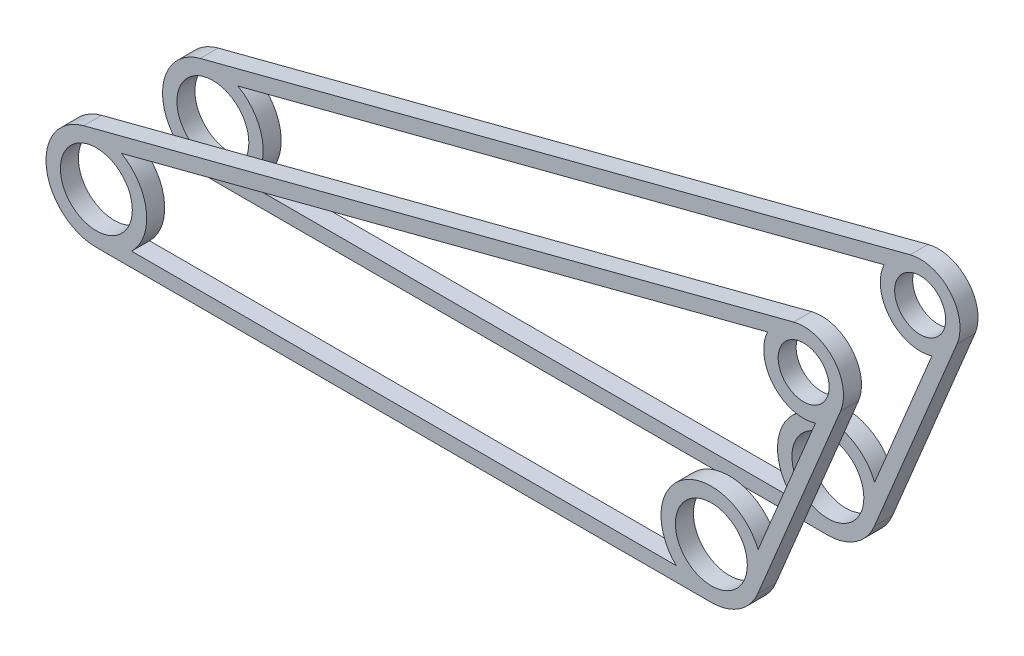
ISO-10303-21;
HEADER;
FILE_DESCRIPTION(('STEP AP214'),'2;1');
FILE_NAME('part.step','',(''),(''),'','','');
FILE_SCHEMA(('AUTOMOTIVE_DESIGN { 1 0 10303 214 1 1 1 1 }'));
ENDSEC;
DATA;
#1=APPLICATION_CONTEXT('core data for automotive mechanical design processes');
#2=APPLICATION_PROTOCOL_DEFINITION('international standard','automotive_design',2000,#1);
#3=PRODUCT_CONTEXT('',#1,'mechanical');
#4=PRODUCT('Part','Part','',(#3));
#5=PRODUCT_RELATED_PRODUCT_CATEGORY('part','',(#4));
#6=PRODUCT_DEFINITION_FORMATION('','',#4);
#7=PRODUCT_DEFINITION_CONTEXT('part definition',#1,'design');
#8=PRODUCT_DEFINITION('design','',#6,#7);
#9=PRODUCT_DEFINITION_SHAPE('','',#8);
#10=(LENGTH_UNIT() NAMED_UNIT(*) SI_UNIT(.MILLI.,.METRE.));
#11=(NAMED_UNIT(*) PLANE_ANGLE_UNIT() SI_UNIT($,.RADIAN.));
#12=(NAMED_UNIT(*) SI_UNIT($,.STERADIAN.) SOLID_ANGLE_UNIT());
#13=UNCERTAINTY_MEASURE_WITH_UNIT(LENGTH_MEASURE(1.E-05),#10,'distance_accuracy_value','');
#14=(GEOMETRIC_REPRESENTATION_CONTEXT(3) GLOBAL_UNCERTAINTY_ASSIGNED_CONTEXT((#13)) GLOBAL_UNIT_ASSIGNED_CONTEXT((#10,
#11,#12)) REPRESENTATION_CONTEXT('',''));
#15=CARTESIAN_POINT('',(0.,0.,0.));
#16=DIRECTION('',(0.,0.,1.));
#17=DIRECTION('',(1.,0.,0.));
#18=AXIS2_PLACEMENT_3D('',#15,#16,#17);
#19=CARTESIAN_POINT('',(108.585,0.,-11.8745));
#20=DIRECTION('',(0.,0.,1.));
#21=DIRECTION('',(1.,0.,0.));
#22=AXIS2_PLACEMENT_3D('',#19,#20,#21);
#23=CYLINDRICAL_SURFACE('',#22,8.88999999999992);
#24=CARTESIAN_POINT('',(108.585,0.,-8.6995));
#25=DIRECTION('',(0.,0.,1.));
#26=DIRECTION('',(1.,0.,0.));
#27=AXIS2_PLACEMENT_3D('',#24,#25,#26);
#28=CIRCLE('',#27,8.88999999999992);
#29=CARTESIAN_POINT('',(108.585,-8.88999999999996,-8.6995));
#30=VERTEX_POINT('',#29);
#31=CARTESIAN_POINT('',(116.796258377343,-3.40695404437924,-8.6995));
#32=VERTEX_POINT('',#31);
#33=EDGE_CURVE('E202',#30,#32,#28,.T.);
#34=ORIENTED_EDGE('',*,*,#33,.F.);
#35=DIRECTION('',(0.,0.,1.));
#36=VECTOR('',#35,1.);
#37=CARTESIAN_POINT('',(108.585,-8.88999999999996,-11.8745));
#38=LINE('',#37,#36);
#39=CARTESIAN_POINT('',(108.585,-8.88999999999996,-11.8745));
#40=VERTEX_POINT('',#39);
#41=EDGE_CURVE('E12',#40,#30,#38,.T.);
#42=ORIENTED_EDGE('',*,*,#41,.F.);
#43=CARTESIAN_POINT('',(108.585,0.,-11.8745));
#44=DIRECTION('',(0.,0.,1.));
#45=DIRECTION('',(1.,0.,0.));
#46=AXIS2_PLACEMENT_3D('',#43,#44,#45);
#47=CIRCLE('',#46,8.88999999999992);
#48=CARTESIAN_POINT('',(116.796258377343,-3.40695404437924,-11.8745));
#49=VERTEX_POINT('',#48);
#50=EDGE_CURVE('E304',#40,#49,#47,.T.);
#51=ORIENTED_EDGE('',*,*,#50,.T.);
#52=DIRECTION('',(0.,0.,1.));
#53=VECTOR('',#52,1.);
#54=CARTESIAN_POINT('',(116.796258377343,-3.40695404437924,-11.8745));
#55=LINE('',#54,#53);
#56=EDGE_CURVE('E224',#49,#32,#55,.T.);
#57=ORIENTED_EDGE('',*,*,#56,.T.);
#58=EDGE_LOOP('',(#34,#42,#51,#57));
#59=FACE_BOUND('',#58,.T.);
#60=ADVANCED_FACE('F53',(#59),#23,.T.);
#61=CARTESIAN_POINT('',(0.,-8.89,-11.8745));
#62=DIRECTION('',(0.,1.,0.));
#63=DIRECTION('',(0.,0.,1.));
#64=AXIS2_PLACEMENT_3D('',#61,#62,#63);
#65=PLANE('',#64);
#66=DIRECTION('',(-1.,0.,0.));
#67=VECTOR('',#66,1.);
#68=CARTESIAN_POINT('',(0.,-8.89,-8.6995));
#69=LINE('',#68,#67);
#70=CARTESIAN_POINT('',(0.,-8.89,-8.6995));
#71=VERTEX_POINT('',#70);
#72=EDGE_CURVE('E214',#30,#71,#69,.T.);
#73=ORIENTED_EDGE('',*,*,#72,.T.);
#74=DIRECTION('',(0.,0.,1.));
#75=VECTOR('',#74,1.);
#76=CARTESIAN_POINT('',(0.,-8.89,-11.8745));
#77=LINE('',#76,#75);
#78=CARTESIAN_POINT('',(0.,-8.89,-11.8745));
#79=VERTEX_POINT('',#78);
#80=EDGE_CURVE('E63',#79,#71,#77,.T.);
#81=ORIENTED_EDGE('',*,*,#80,.F.);
#82=DIRECTION('',(-1.,0.,0.));
#83=VECTOR('',#82,1.);
#84=CARTESIAN_POINT('',(0.,-8.89,-11.8745));
#85=LINE('',#84,#83);
#86=EDGE_CURVE('E170',#40,#79,#85,.T.);
#87=ORIENTED_EDGE('',*,*,#86,.F.);
#88=ORIENTED_EDGE('',*,*,#41,.T.);
#89=EDGE_LOOP('',(#73,#81,#87,#88));
#90=FACE_BOUND('',#89,.T.);
#91=ADVANCED_FACE('F261',(#90),#65,.F.);
#92=CARTESIAN_POINT('',(0.,0.,-11.8745));
#93=DIRECTION('',(0.,0.,1.));
#94=DIRECTION('',(1.,0.,0.));
#95=AXIS2_PLACEMENT_3D('',#92,#93,#94);
#96=CYLINDRICAL_SURFACE('',#95,8.89);
#97=CARTESIAN_POINT('',(0.,0.,-8.6995));
#98=DIRECTION('',(0.,0.,1.));
#99=DIRECTION('',(1.,0.,0.));
#100=AXIS2_PLACEMENT_3D('',#97,#98,#99);
#101=CIRCLE('',#100,8.89);
#102=CARTESIAN_POINT('',(-2.24093910567499,8.60292345221417,-8.6995));
#103=VERTEX_POINT('',#102);
#104=EDGE_CURVE('E153',#103,#71,#101,.T.);
#105=ORIENTED_EDGE('',*,*,#104,.F.);
#106=DIRECTION('',(0.,0.,1.));
#107=VECTOR('',#106,1.);
#108=CARTESIAN_POINT('',(-2.24093910567499,8.60292345221417,-11.8745));
#109=LINE('',#108,#107);
#110=CARTESIAN_POINT('',(-2.24093910567499,8.60292345221417,-11.8745));
#111=VERTEX_POINT('',#110);
#112=EDGE_CURVE('E147',#111,#103,#109,.T.);
#113=ORIENTED_EDGE('',*,*,#112,.F.);
#114=CARTESIAN_POINT('',(0.,0.,-11.8745));
#115=DIRECTION('',(0.,0.,1.));
#116=DIRECTION('',(1.,0.,0.));
#117=AXIS2_PLACEMENT_3D('',#114,#115,#116);
#118=CIRCLE('',#117,8.89);
#119=EDGE_CURVE('E151',#111,#79,#118,.T.);
#120=ORIENTED_EDGE('',*,*,#119,.T.);
#121=ORIENTED_EDGE('',*,*,#80,.T.);
#122=EDGE_LOOP('',(#105,#113,#120,#121));
#123=FACE_BOUND('',#122,.T.);
#124=ADVANCED_FACE('F149',(#123),#96,.T.);
#125=CARTESIAN_POINT('',(-2.24093910567499,8.60292345221417,-11.8745));
#126=DIRECTION('',(0.252074140120921,-0.967707924883484,0.));
#127=DIRECTION('',(0.967707924883484,0.252074140120921,0.));
#128=AXIS2_PLACEMENT_3D('',#125,#126,#127);
#129=PLANE('',#128);
#130=DIRECTION('',(0.967707924883484,0.252074140120921,0.));
#131=VECTOR('',#130,1.);
#132=CARTESIAN_POINT('',(-2.24093910567499,8.60292345221417,-8.6995));
#133=LINE('',#132,#131);
#134=CARTESIAN_POINT('',(123.103161211443,41.253277442518,-8.6995));
#135=VERTEX_POINT('',#134);
#136=EDGE_CURVE('E211',#103,#135,#133,.T.);
#137=ORIENTED_EDGE('',*,*,#136,.T.);
#138=DIRECTION('',(0.,0.,1.));
#139=VECTOR('',#138,1.);
#140=CARTESIAN_POINT('',(123.103161211443,41.253277442518,-11.8745));
#141=LINE('',#140,#139);
#142=CARTESIAN_POINT('',(123.103161211443,41.253277442518,-11.8745));
#143=VERTEX_POINT('',#142);
#144=EDGE_CURVE('E157',#143,#135,#141,.T.);
#145=ORIENTED_EDGE('',*,*,#144,.F.);
#146=DIRECTION('',(0.967707924883484,0.252074140120921,0.));
#147=VECTOR('',#146,1.);
#148=CARTESIAN_POINT('',(-2.24093910567499,8.60292345221417,-11.8745));
#149=LINE('',#148,#147);
#150=EDGE_CURVE('E160',#111,#143,#149,.T.);
#151=ORIENTED_EDGE('',*,*,#150,.F.);
#152=ORIENTED_EDGE('',*,*,#112,.T.);
#153=EDGE_LOOP('',(#137,#145,#151,#152));
#154=FACE_BOUND('',#153,.T.);
#155=ADVANCED_FACE('F161',(#154),#129,.F.);
#156=CARTESIAN_POINT('',(124.877763157895,34.4406136513383,-11.8745));
#157=DIRECTION('',(0.,0.,1.));
#158=DIRECTION('',(1.,0.,0.));
#159=AXIS2_PLACEMENT_3D('',#156,#157,#158);
#160=CYLINDRICAL_SURFACE('',#159,7.04000000000003);
#161=CARTESIAN_POINT('',(124.877763157895,34.4406136513383,-8.6995));
#162=DIRECTION('',(0.,0.,1.));
#163=DIRECTION('',(1.,0.,0.));
#164=AXIS2_PLACEMENT_3D('',#161,#162,#163);
#165=CIRCLE('',#164,7.04000000000003);
#166=CARTESIAN_POINT('',(131.380266979773,31.7426432944845,-8.6995));
#167=VERTEX_POINT('',#166);
#168=EDGE_CURVE('E208',#167,#135,#165,.T.);
#169=ORIENTED_EDGE('',*,*,#168,.F.);
#170=DIRECTION('',(0.,0.,1.));
#171=VECTOR('',#170,1.);
#172=CARTESIAN_POINT('',(131.380266979773,31.7426432944845,-11.8745));
#173=LINE('',#172,#171);
#174=CARTESIAN_POINT('',(131.380266979773,31.7426432944845,-11.8745));
#175=VERTEX_POINT('',#174);
#176=EDGE_CURVE('E222',#175,#167,#173,.T.);
#177=ORIENTED_EDGE('',*,*,#176,.F.);
#178=CARTESIAN_POINT('',(124.877763157895,34.4406136513383,-11.8745));
#179=DIRECTION('',(0.,0.,1.));
#180=DIRECTION('',(1.,0.,0.));
#181=AXIS2_PLACEMENT_3D('',#178,#179,#180);
#182=CIRCLE('',#181,7.04000000000003);
#183=EDGE_CURVE('E165',#175,#143,#182,.T.);
#184=ORIENTED_EDGE('',*,*,#183,.T.);
#185=ORIENTED_EDGE('',*,*,#144,.T.);
#186=EDGE_LOOP('',(#169,#177,#184,#185));
#187=FACE_BOUND('',#186,.T.);
#188=ADVANCED_FACE('F313',(#187),#160,.T.);
#189=CARTESIAN_POINT('',(98.5024549059795,-40.8699034546516,-11.8745));
#190=DIRECTION('',(0.923651111062219,-0.383234425689456,0.));
#191=DIRECTION('',(0.383234425689456,0.923651111062219,0.));
#192=AXIS2_PLACEMENT_3D('',#189,#190,#191);
#193=PLANE('',#192);
#194=DIRECTION('',(0.383234425689456,0.923651111062219,0.));
#195=VECTOR('',#194,1.);
#196=CARTESIAN_POINT('',(98.5024549059795,-40.8699034546516,-8.6995));
#197=LINE('',#196,#195);
#198=CARTESIAN_POINT('',(116.834555694057,3.31314515991316,-8.6995));
#199=VERTEX_POINT('',#198);
#200=CARTESIAN_POINT('',(126.959354756851,27.7153942188472,-8.6995));
#201=VERTEX_POINT('',#200);
#202=EDGE_CURVE('E181',#199,#201,#197,.T.);
#203=ORIENTED_EDGE('',*,*,#202,.T.);
#204=DIRECTION('',(0.,0.,1.));
#205=VECTOR('',#204,1.);
#206=CARTESIAN_POINT('',(126.959354756851,27.7153942188472,-11.8745));
#207=LINE('',#206,#205);
#208=CARTESIAN_POINT('',(126.959354756851,27.7153942188472,-11.8745));
#209=VERTEX_POINT('',#208);
#210=EDGE_CURVE('E226',#209,#201,#207,.T.);
#211=ORIENTED_EDGE('',*,*,#210,.F.);
#212=DIRECTION('',(0.383234425689456,0.923651111062219,0.));
#213=VECTOR('',#212,1.);
#214=CARTESIAN_POINT('',(98.5024549059795,-40.8699034546516,-11.8745));
#215=LINE('',#214,#213);
#216=CARTESIAN_POINT('',(116.834555694057,3.31314515991316,-11.8745));
#217=VERTEX_POINT('',#216);
#218=EDGE_CURVE('E239',#217,#209,#215,.T.);
#219=ORIENTED_EDGE('',*,*,#218,.F.);
#220=DIRECTION('',(0.,0.,1.));
#221=VECTOR('',#220,1.);
#222=CARTESIAN_POINT('',(116.834555694057,3.31314515991316,-11.8745));
#223=LINE('',#222,#221);
#224=EDGE_CURVE('E57',#217,#199,#223,.T.);
#225=ORIENTED_EDGE('',*,*,#224,.T.);
#226=EDGE_LOOP('',(#203,#211,#219,#225));
#227=FACE_BOUND('',#226,.T.);
#228=ADVANCED_FACE('F237',(#227),#193,.F.);
#229=CARTESIAN_POINT('',(124.877763157895,34.4406136513383,-11.8745));
#230=DIRECTION('',(0.,0.,1.));
#231=DIRECTION('',(1.,0.,0.));
#232=AXIS2_PLACEMENT_3D('',#229,#230,#231);
#233=CYLINDRICAL_SURFACE('',#232,7.04000000000003);
#234=CARTESIAN_POINT('',(124.877763157895,34.4406136513383,-8.6995));
#235=DIRECTION('',(0.,0.,1.));
#236=DIRECTION('',(1.,0.,0.));
#237=AXIS2_PLACEMENT_3D('',#234,#235,#236);
#238=CIRCLE('',#237,7.04000000000003);
#239=CARTESIAN_POINT('',(118.504240590403,37.4305651696196,-8.6995));
#240=VERTEX_POINT('',#239);
#241=EDGE_CURVE('E196',#240,#201,#238,.T.);
#242=ORIENTED_EDGE('',*,*,#241,.F.);
#243=DIRECTION('',(0.,0.,1.));
#244=VECTOR('',#243,1.);
#245=CARTESIAN_POINT('',(118.504240590403,37.4305651696196,-11.8745));
#246=LINE('',#245,#244);
#247=CARTESIAN_POINT('',(118.504240590403,37.4305651696196,-11.8745));
#248=VERTEX_POINT('',#247);
#249=EDGE_CURVE('E228',#248,#240,#246,.T.);
#250=ORIENTED_EDGE('',*,*,#249,.F.);
#251=CARTESIAN_POINT('',(124.877763157895,34.4406136513383,-11.8745));
#252=DIRECTION('',(0.,0.,1.));
#253=DIRECTION('',(1.,0.,0.));
#254=AXIS2_PLACEMENT_3D('',#251,#252,#253);
#255=CIRCLE('',#254,7.04000000000003);
#256=EDGE_CURVE('E298',#248,#209,#255,.T.);
#257=ORIENTED_EDGE('',*,*,#256,.T.);
#258=ORIENTED_EDGE('',*,*,#210,.T.);
#259=EDGE_LOOP('',(#242,#250,#257,#258));
#260=FACE_BOUND('',#259,.T.);
#261=ADVANCED_FACE('F270',(#260),#233,.T.);
#262=CARTESIAN_POINT('',(-1.60067078976785,6.14494532301012,-11.8745));
#263=DIRECTION('',(0.252074140120921,-0.967707924883484,0.));
#264=DIRECTION('',(0.967707924883484,0.252074140120921,0.));
#265=AXIS2_PLACEMENT_3D('',#262,#263,#264);
#266=PLANE('',#265);
#267=DIRECTION('',(0.967707924883484,0.252074140120921,0.));
#268=VECTOR('',#267,1.);
#269=CARTESIAN_POINT('',(-1.60067078976785,6.14494532301012,-8.6995));
#270=LINE('',#269,#268);
#271=CARTESIAN_POINT('',(4.42012142570285,7.71327599545372,-8.6995));
#272=VERTEX_POINT('',#271);
#273=EDGE_CURVE('E193',#272,#240,#270,.T.);
#274=ORIENTED_EDGE('',*,*,#273,.F.);
#275=DIRECTION('',(0.,0.,1.));
#276=VECTOR('',#275,1.);
#277=CARTESIAN_POINT('',(4.42012142570285,7.71327599545372,-11.8745));
#278=LINE('',#277,#276);
#279=CARTESIAN_POINT('',(4.42012142570285,7.71327599545372,-11.8745));
#280=VERTEX_POINT('',#279);
#281=EDGE_CURVE('E230',#280,#272,#278,.T.);
#282=ORIENTED_EDGE('',*,*,#281,.F.);
#283=DIRECTION('',(0.967707924883484,0.252074140120921,0.));
#284=VECTOR('',#283,1.);
#285=CARTESIAN_POINT('',(-1.60067078976785,6.14494532301012,-11.8745));
#286=LINE('',#285,#284);
#287=EDGE_CURVE('E301',#280,#248,#286,.T.);
#288=ORIENTED_EDGE('',*,*,#287,.T.);
#289=ORIENTED_EDGE('',*,*,#249,.T.);
#290=EDGE_LOOP('',(#274,#282,#288,#289));
#291=FACE_BOUND('',#290,.T.);
#292=ADVANCED_FACE('F273',(#291),#266,.T.);
#293=CARTESIAN_POINT('',(0.,0.,-11.8745));
#294=DIRECTION('',(0.,0.,1.));
#295=DIRECTION('',(1.,0.,0.));
#296=AXIS2_PLACEMENT_3D('',#293,#294,#295);
#297=CYLINDRICAL_SURFACE('',#296,8.89);
#298=CARTESIAN_POINT('',(0.,0.,-8.6995));
#299=DIRECTION('',(0.,0.,1.));
#300=DIRECTION('',(1.,0.,0.));
#301=AXIS2_PLACEMENT_3D('',#298,#299,#300);
#302=CIRCLE('',#301,8.89);
#303=CARTESIAN_POINT('',(6.22170394666927,-6.35,-8.6995));
#304=VERTEX_POINT('',#303);
#305=EDGE_CURVE('E190',#304,#272,#302,.T.);
#306=ORIENTED_EDGE('',*,*,#305,.F.);
#307=DIRECTION('',(0.,0.,1.));
#308=VECTOR('',#307,1.);
#309=CARTESIAN_POINT('',(6.22170394666927,-6.35,-11.8745));
#310=LINE('',#309,#308);
#311=CARTESIAN_POINT('',(6.22170394666927,-6.35,-11.8745));
#312=VERTEX_POINT('',#311);
#313=EDGE_CURVE('E232',#312,#304,#310,.T.);
#314=ORIENTED_EDGE('',*,*,#313,.F.);
#315=CARTESIAN_POINT('',(0.,0.,-11.8745));
#316=DIRECTION('',(0.,0.,1.));
#317=DIRECTION('',(1.,0.,0.));
#318=AXIS2_PLACEMENT_3D('',#315,#316,#317);
#319=CIRCLE('',#318,8.89);
#320=EDGE_CURVE('E293',#312,#280,#319,.T.);
#321=ORIENTED_EDGE('',*,*,#320,.T.);
#322=ORIENTED_EDGE('',*,*,#281,.T.);
#323=EDGE_LOOP('',(#306,#314,#321,#322));
#324=FACE_BOUND('',#323,.T.);
#325=ADVANCED_FACE('F277',(#324),#297,.T.);
#326=CARTESIAN_POINT('',(0.,-6.35,-11.8745));
#327=DIRECTION('',(0.,-1.,0.));
#328=DIRECTION('',(1.,0.,0.));
#329=AXIS2_PLACEMENT_3D('',#326,#327,#328);
#330=PLANE('',#329);
#331=DIRECTION('',(1.,0.,0.));
#332=VECTOR('',#331,1.);
#333=CARTESIAN_POINT('',(0.,-6.35,-8.6995));
#334=LINE('',#333,#332);
#335=CARTESIAN_POINT('',(102.363296053331,-6.35,-8.6995));
#336=VERTEX_POINT('',#335);
#337=EDGE_CURVE('E187',#304,#336,#334,.T.);
#338=ORIENTED_EDGE('',*,*,#337,.T.);
#339=DIRECTION('',(0.,0.,1.));
#340=VECTOR('',#339,1.);
#341=CARTESIAN_POINT('',(102.363296053331,-6.35,-11.8745));
#342=LINE('',#341,#340);
#343=CARTESIAN_POINT('',(102.363296053331,-6.35,-11.8745));
#344=VERTEX_POINT('',#343);
#345=EDGE_CURVE('E233',#344,#336,#342,.T.);
#346=ORIENTED_EDGE('',*,*,#345,.F.);
#347=DIRECTION('',(1.,0.,0.));
#348=VECTOR('',#347,1.);
#349=CARTESIAN_POINT('',(0.,-6.35,-11.8745));
#350=LINE('',#349,#348);
#351=EDGE_CURVE('E489',#312,#344,#350,.T.);
#352=ORIENTED_EDGE('',*,*,#351,.F.);
#353=ORIENTED_EDGE('',*,*,#313,.T.);
#354=EDGE_LOOP('',(#338,#346,#352,#353));
#355=FACE_BOUND('',#354,.T.);
#356=ADVANCED_FACE('F280',(#355),#330,.F.);
#357=CARTESIAN_POINT('',(100.848528728078,-41.8433188959028,-11.8745));
#358=DIRECTION('',(-0.92365111106222,0.383234425689455,0.));
#359=DIRECTION('',(-0.383234425689455,-0.92365111106222,0.));
#360=AXIS2_PLACEMENT_3D('',#357,#358,#359);
#361=PLANE('',#360);
#362=DIRECTION('',(-0.383234425689455,-0.92365111106222,0.));
#363=VECTOR('',#362,1.);
#364=CARTESIAN_POINT('',(100.848528728078,-41.8433188959028,-8.6995));
#365=LINE('',#364,#363);
#366=EDGE_CURVE('E205',#167,#32,#365,.T.);
#367=ORIENTED_EDGE('',*,*,#366,.T.);
#368=ORIENTED_EDGE('',*,*,#56,.F.);
#369=DIRECTION('',(-0.383234425689455,-0.92365111106222,0.));
#370=VECTOR('',#369,1.);
#371=CARTESIAN_POINT('',(100.848528728078,-41.8433188959028,-11.8745));
#372=LINE('',#371,#370);
#373=EDGE_CURVE('E310',#175,#49,#372,.T.);
#374=ORIENTED_EDGE('',*,*,#373,.F.);
#375=ORIENTED_EDGE('',*,*,#176,.T.);
#376=EDGE_LOOP('',(#367,#368,#374,#375));
#377=FACE_BOUND('',#376,.T.);
#378=ADVANCED_FACE('F256',(#377),#361,.F.);
#379=CARTESIAN_POINT('',(124.877763157895,34.4406136513383,-11.8745));
#380=DIRECTION('',(0.,0.,1.));
#381=DIRECTION('',(1.,0.,0.));
#382=AXIS2_PLACEMENT_3D('',#379,#380,#381);
#383=CYLINDRICAL_SURFACE('',#382,4.50000000000002);
#384=CARTESIAN_POINT('',(124.877763157895,34.4406136513383,-11.8745));
#385=DIRECTION('',(0.,0.,1.));
#386=DIRECTION('',(1.,0.,0.));
#387=AXIS2_PLACEMENT_3D('',#384,#385,#386);
#388=CIRCLE('',#387,4.50000000000002);
#389=CARTESIAN_POINT('',(129.377763157895,34.4406136513383,-11.8745));
#390=VERTEX_POINT('',#389);
#391=EDGE_CURVE('E300',#390,#390,#388,.T.);
#392=ORIENTED_EDGE('',*,*,#391,.F.);
#393=EDGE_LOOP('',(#392));
#394=FACE_BOUND('',#393,.T.);
#395=CARTESIAN_POINT('',(124.877763157895,34.4406136513383,-8.6995));
#396=DIRECTION('',(0.,0.,1.));
#397=DIRECTION('',(1.,0.,0.));
#398=AXIS2_PLACEMENT_3D('',#395,#396,#397);
#399=CIRCLE('',#398,4.50000000000002);
#400=CARTESIAN_POINT('',(129.377763157895,34.4406136513383,-8.6995));
#401=VERTEX_POINT('',#400);
#402=EDGE_CURVE('E199',#401,#401,#399,.T.);
#403=ORIENTED_EDGE('',*,*,#402,.T.);
#404=EDGE_LOOP('',(#403));
#405=FACE_BOUND('',#404,.T.);
#406=ADVANCED_FACE('F248',(#394,#405),#383,.F.);
#407=CARTESIAN_POINT('',(108.585,0.,-11.8745));
#408=DIRECTION('',(0.,0.,1.));
#409=DIRECTION('',(1.,0.,0.));
#410=AXIS2_PLACEMENT_3D('',#407,#408,#409);
#411=CYLINDRICAL_SURFACE('',#410,8.88999999999992);
#412=CARTESIAN_POINT('',(108.585,0.,-8.6995));
#413=DIRECTION('',(0.,0.,1.));
#414=DIRECTION('',(1.,0.,0.));
#415=AXIS2_PLACEMENT_3D('',#412,#413,#414);
#416=CIRCLE('',#415,8.88999999999992);
#417=EDGE_CURVE('E184',#199,#336,#416,.T.);
#418=ORIENTED_EDGE('',*,*,#417,.F.);
#419=ORIENTED_EDGE('',*,*,#224,.F.);
#420=CARTESIAN_POINT('',(108.585,0.,-11.8745));
#421=DIRECTION('',(0.,0.,1.));
#422=DIRECTION('',(1.,0.,0.));
#423=AXIS2_PLACEMENT_3D('',#420,#421,#422);
#424=CIRCLE('',#423,8.88999999999992);
#425=EDGE_CURVE('E487',#217,#344,#424,.T.);
#426=ORIENTED_EDGE('',*,*,#425,.T.);
#427=ORIENTED_EDGE('',*,*,#345,.T.);
#428=EDGE_LOOP('',(#418,#419,#426,#427));
#429=FACE_BOUND('',#428,.T.);
#430=ADVANCED_FACE('F246',(#429),#411,.T.);
#431=CARTESIAN_POINT('',(108.585,0.,-11.8745));
#432=DIRECTION('',(0.,0.,1.));
#433=DIRECTION('',(1.,0.,0.));
#434=AXIS2_PLACEMENT_3D('',#431,#432,#433);
#435=CYLINDRICAL_SURFACE('',#434,6.35000000000007);
#436=CARTESIAN_POINT('',(108.585,0.,-11.8745));
#437=DIRECTION('',(0.,0.,1.));
#438=DIRECTION('',(1.,0.,0.));
#439=AXIS2_PLACEMENT_3D('',#436,#437,#438);
#440=CIRCLE('',#439,6.35000000000007);
#441=CARTESIAN_POINT('',(114.935,0.,-11.8745));
#442=VERTEX_POINT('',#441);
#443=EDGE_CURVE('E218',#442,#442,#440,.T.);
#444=ORIENTED_EDGE('',*,*,#443,.F.);
#445=EDGE_LOOP('',(#444));
#446=FACE_BOUND('',#445,.T.);
#447=CARTESIAN_POINT('',(108.585,0.,-8.6995));
#448=DIRECTION('',(0.,0.,1.));
#449=DIRECTION('',(1.,0.,0.));
#450=AXIS2_PLACEMENT_3D('',#447,#448,#449);
#451=CIRCLE('',#450,6.35000000000007);
#452=CARTESIAN_POINT('',(114.935,0.,-8.6995));
#453=VERTEX_POINT('',#452);
#454=EDGE_CURVE('E178',#453,#453,#451,.T.);
#455=ORIENTED_EDGE('',*,*,#454,.T.);
#456=EDGE_LOOP('',(#455));
#457=FACE_BOUND('',#456,.T.);
#458=ADVANCED_FACE('F55',(#446,#457),#435,.F.);
#459=CARTESIAN_POINT('',(0.,0.,-11.8745));
#460=DIRECTION('',(0.,0.,1.));
#461=DIRECTION('',(1.,0.,0.));
#462=AXIS2_PLACEMENT_3D('',#459,#460,#461);
#463=CYLINDRICAL_SURFACE('',#462,6.35);
#464=CARTESIAN_POINT('',(0.,0.,-11.8745));
#465=DIRECTION('',(0.,0.,1.));
#466=DIRECTION('',(1.,0.,0.));
#467=AXIS2_PLACEMENT_3D('',#464,#465,#466);
#468=CIRCLE('',#467,6.35);
#469=CARTESIAN_POINT('',(6.35,0.,-11.8745));
#470=VERTEX_POINT('',#469);
#471=EDGE_CURVE('E172',#470,#470,#468,.T.);
#472=ORIENTED_EDGE('',*,*,#471,.F.);
#473=EDGE_LOOP('',(#472));
#474=FACE_BOUND('',#473,.T.);
#475=CARTESIAN_POINT('',(0.,0.,-8.6995));
#476=DIRECTION('',(0.,0.,1.));
#477=DIRECTION('',(1.,0.,0.));
#478=AXIS2_PLACEMENT_3D('',#475,#476,#477);
#479=CIRCLE('',#478,6.35);
#480=CARTESIAN_POINT('',(6.35,0.,-8.6995));
#481=VERTEX_POINT('',#480);
#482=EDGE_CURVE('E216',#481,#481,#479,.T.);
#483=ORIENTED_EDGE('',*,*,#482,.T.);
#484=EDGE_LOOP('',(#483));
#485=FACE_BOUND('',#484,.T.);
#486=ADVANCED_FACE('F254',(#474,#485),#463,.F.);
#487=CARTESIAN_POINT('',(0.,0.,-11.8745));
#488=DIRECTION('',(0.,0.,1.));
#489=DIRECTION('',(1.,0.,0.));
#490=AXIS2_PLACEMENT_3D('',#487,#488,#489);
#491=PLANE('',#490);
#492=ORIENTED_EDGE('',*,*,#443,.T.);
#493=EDGE_LOOP('',(#492));
#494=FACE_BOUND('',#493,.T.);
#495=ORIENTED_EDGE('',*,*,#218,.T.);
#496=ORIENTED_EDGE('',*,*,#256,.F.);
#497=ORIENTED_EDGE('',*,*,#287,.F.);
#498=ORIENTED_EDGE('',*,*,#320,.F.);
#499=ORIENTED_EDGE('',*,*,#351,.T.);
#500=ORIENTED_EDGE('',*,*,#425,.F.);
#501=EDGE_LOOP('',(#495,#496,#497,#498,#499,#500));
#502=FACE_BOUND('',#501,.T.);
#503=ORIENTED_EDGE('',*,*,#391,.T.);
#504=EDGE_LOOP('',(#503));
#505=FACE_BOUND('',#504,.T.);
#506=ORIENTED_EDGE('',*,*,#50,.F.);
#507=ORIENTED_EDGE('',*,*,#86,.T.);
#508=ORIENTED_EDGE('',*,*,#119,.F.);
#509=ORIENTED_EDGE('',*,*,#150,.T.);
#510=ORIENTED_EDGE('',*,*,#183,.F.);
#511=ORIENTED_EDGE('',*,*,#373,.T.);
#512=EDGE_LOOP('',(#506,#507,#508,#509,#510,#511));
#513=FACE_BOUND('',#512,.T.);
#514=ORIENTED_EDGE('',*,*,#471,.T.);
#515=EDGE_LOOP('',(#514));
#516=FACE_BOUND('',#515,.T.);
#517=ADVANCED_FACE('F168',(#494,#502,#505,#513,#516),#491,.F.);
#518=CARTESIAN_POINT('',(0.,0.,-8.6995));
#519=DIRECTION('',(0.,0.,1.));
#520=DIRECTION('',(1.,0.,0.));
#521=AXIS2_PLACEMENT_3D('',#518,#519,#520);
#522=PLANE('',#521);
#523=ORIENTED_EDGE('',*,*,#454,.F.);
#524=EDGE_LOOP('',(#523));
#525=FACE_BOUND('',#524,.T.);
#526=ORIENTED_EDGE('',*,*,#202,.F.);
#527=ORIENTED_EDGE('',*,*,#417,.T.);
#528=ORIENTED_EDGE('',*,*,#337,.F.);
#529=ORIENTED_EDGE('',*,*,#305,.T.);
#530=ORIENTED_EDGE('',*,*,#273,.T.);
#531=ORIENTED_EDGE('',*,*,#241,.T.);
#532=EDGE_LOOP('',(#526,#527,#528,#529,#530,#531));
#533=FACE_BOUND('',#532,.T.);
#534=ORIENTED_EDGE('',*,*,#402,.F.);
#535=EDGE_LOOP('',(#534));
#536=FACE_BOUND('',#535,.T.);
#537=ORIENTED_EDGE('',*,*,#33,.T.);
#538=ORIENTED_EDGE('',*,*,#366,.F.);
#539=ORIENTED_EDGE('',*,*,#168,.T.);
#540=ORIENTED_EDGE('',*,*,#136,.F.);
#541=ORIENTED_EDGE('',*,*,#104,.T.);
#542=ORIENTED_EDGE('',*,*,#72,.F.);
#543=EDGE_LOOP('',(#537,#538,#539,#540,#541,#542));
#544=FACE_BOUND('',#543,.T.);
#545=ORIENTED_EDGE('',*,*,#482,.F.);
#546=EDGE_LOOP('',(#545));
#547=FACE_BOUND('',#546,.T.);
#548=ADVANCED_FACE('F242',(#525,#533,#536,#544,#547),#522,.T.);
#549=CLOSED_SHELL('',(#60,#91,#124,#155,#188,#228,#261,#292,#325,#356,#378,#406,#430,#458,#486,
#517,#548));
#550=MANIFOLD_SOLID_BREP('B2',#549);
#551=CARTESIAN_POINT('',(108.585,0.,11.8745));
#552=DIRECTION('',(0.,0.,-1.));
#553=DIRECTION('',(-1.,0.,0.));
#554=AXIS2_PLACEMENT_3D('',#551,#552,#553);
#555=CYLINDRICAL_SURFACE('',#554,8.88999999999992);
#556=CARTESIAN_POINT('',(108.585,0.,8.6995));
#557=DIRECTION('',(0.,0.,1.));
#558=DIRECTION('',(1.,0.,0.));
#559=AXIS2_PLACEMENT_3D('',#556,#557,#558);
#560=CIRCLE('',#559,8.88999999999992);
#561=CARTESIAN_POINT('',(108.585,-8.88999999999996,8.6995));
#562=VERTEX_POINT('',#561);
#563=CARTESIAN_POINT('',(116.796258377343,-3.40695404437924,8.6995));
#564=VERTEX_POINT('',#563);
#565=EDGE_CURVE('E652',#562,#564,#560,.T.);
#566=ORIENTED_EDGE('',*,*,#565,.T.);
#567=DIRECTION('',(0.,0.,-1.));
#568=VECTOR('',#567,1.);
#569=CARTESIAN_POINT('',(116.796258377343,-3.40695404437924,11.8745));
#570=LINE('',#569,#568);
#571=CARTESIAN_POINT('',(116.796258377343,-3.40695404437924,11.8745));
#572=VERTEX_POINT('',#571);
#573=EDGE_CURVE('E51',#572,#564,#570,.T.);
#574=ORIENTED_EDGE('',*,*,#573,.F.);
#575=CARTESIAN_POINT('',(108.585,0.,11.8745));
#576=DIRECTION('',(0.,0.,1.));
#577=DIRECTION('',(1.,0.,0.));
#578=AXIS2_PLACEMENT_3D('',#575,#576,#577);
#579=CIRCLE('',#578,8.88999999999992);
#580=CARTESIAN_POINT('',(108.585,-8.88999999999996,11.8745));
#581=VERTEX_POINT('',#580);
#582=EDGE_CURVE('E727',#581,#572,#579,.T.);
#583=ORIENTED_EDGE('',*,*,#582,.F.);
#584=DIRECTION('',(0.,0.,-1.));
#585=VECTOR('',#584,1.);
#586=CARTESIAN_POINT('',(108.585,-8.88999999999996,11.8745));
#587=LINE('',#586,#585);
#588=EDGE_CURVE('E517',#581,#562,#587,.T.);
#589=ORIENTED_EDGE('',*,*,#588,.T.);
#590=EDGE_LOOP('',(#566,#574,#583,#589));
#591=FACE_BOUND('',#590,.T.);
#592=ADVANCED_FACE('F498',(#591),#555,.T.);
#593=CARTESIAN_POINT('',(100.848528728078,-41.8433188959028,11.8745));
#594=DIRECTION('',(0.92365111106222,-0.383234425689455,0.));
#595=DIRECTION('',(0.383234425689455,0.92365111106222,0.));
#596=AXIS2_PLACEMENT_3D('',#593,#594,#595);
#597=PLANE('',#596);
#598=DIRECTION('',(-0.383234425689455,-0.92365111106222,0.));
#599=VECTOR('',#598,1.);
#600=CARTESIAN_POINT('',(100.848528728078,-41.8433188959028,8.6995));
#601=LINE('',#600,#599);
#602=CARTESIAN_POINT('',(131.380266979773,31.7426432944845,8.6995));
#603=VERTEX_POINT('',#602);
#604=EDGE_CURVE('E654',#603,#564,#601,.T.);
#605=ORIENTED_EDGE('',*,*,#604,.F.);
#606=DIRECTION('',(0.,0.,-1.));
#607=VECTOR('',#606,1.);
#608=CARTESIAN_POINT('',(131.380266979773,31.7426432944845,11.8745));
#609=LINE('',#608,#607);
#610=CARTESIAN_POINT('',(131.380266979773,31.7426432944845,11.8745));
#611=VERTEX_POINT('',#610);
#612=EDGE_CURVE('E508',#611,#603,#609,.T.);
#613=ORIENTED_EDGE('',*,*,#612,.F.);
#614=DIRECTION('',(-0.383234425689455,-0.92365111106222,0.));
#615=VECTOR('',#614,1.);
#616=CARTESIAN_POINT('',(100.848528728078,-41.8433188959028,11.8745));
#617=LINE('',#616,#615);
#618=EDGE_CURVE('E619',#611,#572,#617,.T.);
#619=ORIENTED_EDGE('',*,*,#618,.T.);
#620=ORIENTED_EDGE('',*,*,#573,.T.);
#621=EDGE_LOOP('',(#605,#613,#619,#620));
#622=FACE_BOUND('',#621,.T.);
#623=ADVANCED_FACE('F731',(#622),#597,.T.);
#624=CARTESIAN_POINT('',(124.877763157895,34.4406136513383,11.8745));
#625=DIRECTION('',(0.,0.,-1.));
#626=DIRECTION('',(-1.,0.,0.));
#627=AXIS2_PLACEMENT_3D('',#624,#625,#626);
#628=CYLINDRICAL_SURFACE('',#627,7.04000000000003);
#629=CARTESIAN_POINT('',(124.877763157895,34.4406136513383,8.6995));
#630=DIRECTION('',(0.,0.,1.));
#631=DIRECTION('',(1.,0.,0.));
#632=AXIS2_PLACEMENT_3D('',#629,#630,#631);
#633=CIRCLE('',#632,7.04000000000003);
#634=CARTESIAN_POINT('',(123.103161211443,41.253277442518,8.6995));
#635=VERTEX_POINT('',#634);
#636=EDGE_CURVE('E657',#603,#635,#633,.T.);
#637=ORIENTED_EDGE('',*,*,#636,.T.);
#638=DIRECTION('',(0.,0.,-1.));
#639=VECTOR('',#638,1.);
#640=CARTESIAN_POINT('',(123.103161211443,41.253277442518,11.8745));
#641=LINE('',#640,#639);
#642=CARTESIAN_POINT('',(123.103161211443,41.253277442518,11.8745));
#643=VERTEX_POINT('',#642);
#644=EDGE_CURVE('E604',#643,#635,#641,.T.);
#645=ORIENTED_EDGE('',*,*,#644,.F.);
#646=CARTESIAN_POINT('',(124.877763157895,34.4406136513383,11.8745));
#647=DIRECTION('',(0.,0.,1.));
#648=DIRECTION('',(1.,0.,0.));
#649=AXIS2_PLACEMENT_3D('',#646,#647,#648);
#650=CIRCLE('',#649,7.04000000000003);
#651=EDGE_CURVE('E616',#611,#643,#650,.T.);
#652=ORIENTED_EDGE('',*,*,#651,.F.);
#653=ORIENTED_EDGE('',*,*,#612,.T.);
#654=EDGE_LOOP('',(#637,#645,#652,#653));
#655=FACE_BOUND('',#654,.T.);
#656=ADVANCED_FACE('F737',(#655),#628,.T.);
#657=CARTESIAN_POINT('',(-2.24093910567499,8.60292345221417,11.8745));
#658=DIRECTION('',(-0.252074140120921,0.967707924883484,0.));
#659=DIRECTION('',(-0.967707924883484,-0.252074140120921,0.));
#660=AXIS2_PLACEMENT_3D('',#657,#658,#659);
#661=PLANE('',#660);
#662=DIRECTION('',(0.967707924883484,0.252074140120921,0.));
#663=VECTOR('',#662,1.);
#664=CARTESIAN_POINT('',(-2.24093910567499,8.60292345221417,8.6995));
#665=LINE('',#664,#663);
#666=CARTESIAN_POINT('',(-2.24093910567499,8.60292345221417,8.6995));
#667=VERTEX_POINT('',#666);
#668=EDGE_CURVE('E601',#667,#635,#665,.T.);
#669=ORIENTED_EDGE('',*,*,#668,.F.);
#670=DIRECTION('',(0.,0.,-1.));
#671=VECTOR('',#670,1.);
#672=CARTESIAN_POINT('',(-2.24093910567499,8.60292345221417,11.8745));
#673=LINE('',#672,#671);
#674=CARTESIAN_POINT('',(-2.24093910567499,8.60292345221417,11.8745));
#675=VERTEX_POINT('',#674);
#676=EDGE_CURVE('E595',#675,#667,#673,.T.);
#677=ORIENTED_EDGE('',*,*,#676,.F.);
#678=DIRECTION('',(0.967707924883484,0.252074140120921,0.));
#679=VECTOR('',#678,1.);
#680=CARTESIAN_POINT('',(-2.24093910567499,8.60292345221417,11.8745));
#681=LINE('',#680,#679);
#682=EDGE_CURVE('E599',#675,#643,#681,.T.);
#683=ORIENTED_EDGE('',*,*,#682,.T.);
#684=ORIENTED_EDGE('',*,*,#644,.T.);
#685=EDGE_LOOP('',(#669,#677,#683,#684));
#686=FACE_BOUND('',#685,.T.);
#687=ADVANCED_FACE('F597',(#686),#661,.T.);
#688=CARTESIAN_POINT('',(0.,0.,11.8745));
#689=DIRECTION('',(0.,0.,-1.));
#690=DIRECTION('',(-1.,0.,0.));
#691=AXIS2_PLACEMENT_3D('',#688,#689,#690);
#692=CYLINDRICAL_SURFACE('',#691,8.89);
#693=CARTESIAN_POINT('',(0.,0.,8.6995));
#694=DIRECTION('',(0.,0.,1.));
#695=DIRECTION('',(1.,0.,0.));
#696=AXIS2_PLACEMENT_3D('',#693,#694,#695);
#697=CIRCLE('',#696,8.89);
#698=CARTESIAN_POINT('',(0.,-8.89,8.6995));
#699=VERTEX_POINT('',#698);
#700=EDGE_CURVE('E661',#667,#699,#697,.T.);
#701=ORIENTED_EDGE('',*,*,#700,.T.);
#702=DIRECTION('',(0.,0.,-1.));
#703=VECTOR('',#702,1.);
#704=CARTESIAN_POINT('',(0.,-8.89,11.8745));
#705=LINE('',#704,#703);
#706=CARTESIAN_POINT('',(0.,-8.89,11.8745));
#707=VERTEX_POINT('',#706);
#708=EDGE_CURVE('E555',#707,#699,#705,.T.);
#709=ORIENTED_EDGE('',*,*,#708,.F.);
#710=CARTESIAN_POINT('',(0.,0.,11.8745));
#711=DIRECTION('',(0.,0.,1.));
#712=DIRECTION('',(1.,0.,0.));
#713=AXIS2_PLACEMENT_3D('',#710,#711,#712);
#714=CIRCLE('',#713,8.89);
#715=EDGE_CURVE('E606',#675,#707,#714,.T.);
#716=ORIENTED_EDGE('',*,*,#715,.F.);
#717=ORIENTED_EDGE('',*,*,#676,.T.);
#718=EDGE_LOOP('',(#701,#709,#716,#717));
#719=FACE_BOUND('',#718,.T.);
#720=ADVANCED_FACE('F607',(#719),#692,.T.);
#721=CARTESIAN_POINT('',(98.5024549059795,-40.8699034546516,11.8745));
#722=DIRECTION('',(-0.923651111062219,0.383234425689456,0.));
#723=DIRECTION('',(-0.383234425689456,-0.923651111062219,0.));
#724=AXIS2_PLACEMENT_3D('',#721,#722,#723);
#725=PLANE('',#724);
#726=DIRECTION('',(0.383234425689456,0.923651111062219,0.));
#727=VECTOR('',#726,1.);
#728=CARTESIAN_POINT('',(98.5024549059795,-40.8699034546516,8.6995));
#729=LINE('',#728,#727);
#730=CARTESIAN_POINT('',(116.834555694057,3.31314515991316,8.6995));
#731=VERTEX_POINT('',#730);
#732=CARTESIAN_POINT('',(126.959354756851,27.7153942188472,8.6995));
#733=VERTEX_POINT('',#732);
#734=EDGE_CURVE('E631',#731,#733,#729,.T.);
#735=ORIENTED_EDGE('',*,*,#734,.F.);
#736=DIRECTION('',(0.,0.,-1.));
#737=VECTOR('',#736,1.);
#738=CARTESIAN_POINT('',(116.834555694057,3.31314515991316,11.8745));
#739=LINE('',#738,#737);
#740=CARTESIAN_POINT('',(116.834555694057,3.31314515991316,11.8745));
#741=VERTEX_POINT('',#740);
#742=EDGE_CURVE('E502',#741,#731,#739,.T.);
#743=ORIENTED_EDGE('',*,*,#742,.F.);
#744=DIRECTION('',(0.383234425689456,0.923651111062219,0.));
#745=VECTOR('',#744,1.);
#746=CARTESIAN_POINT('',(98.5024549059795,-40.8699034546516,11.8745));
#747=LINE('',#746,#745);
#748=CARTESIAN_POINT('',(126.959354756851,27.7153942188472,11.8745));
#749=VERTEX_POINT('',#748);
#750=EDGE_CURVE('E698',#741,#749,#747,.T.);
#751=ORIENTED_EDGE('',*,*,#750,.T.);
#752=DIRECTION('',(0.,0.,-1.));
#753=VECTOR('',#752,1.);
#754=CARTESIAN_POINT('',(126.959354756851,27.7153942188472,11.8745));
#755=LINE('',#754,#753);
#756=EDGE_CURVE('E627',#749,#733,#755,.T.);
#757=ORIENTED_EDGE('',*,*,#756,.T.);
#758=EDGE_LOOP('',(#735,#743,#751,#757));
#759=FACE_BOUND('',#758,.T.);
#760=ADVANCED_FACE('F696',(#759),#725,.T.);
#761=CARTESIAN_POINT('',(108.585,0.,11.8745));
#762=DIRECTION('',(0.,0.,-1.));
#763=DIRECTION('',(-1.,0.,0.));
#764=AXIS2_PLACEMENT_3D('',#761,#762,#763);
#765=CYLINDRICAL_SURFACE('',#764,8.88999999999992);
#766=CARTESIAN_POINT('',(108.585,0.,8.6995));
#767=DIRECTION('',(0.,0.,1.));
#768=DIRECTION('',(1.,0.,0.));
#769=AXIS2_PLACEMENT_3D('',#766,#767,#768);
#770=CIRCLE('',#769,8.88999999999992);
#771=CARTESIAN_POINT('',(102.363296053331,-6.35,8.6995));
#772=VERTEX_POINT('',#771);
#773=EDGE_CURVE('E634',#731,#772,#770,.T.);
#774=ORIENTED_EDGE('',*,*,#773,.T.);
#775=DIRECTION('',(0.,0.,-1.));
#776=VECTOR('',#775,1.);
#777=CARTESIAN_POINT('',(102.363296053331,-6.35,11.8745));
#778=LINE('',#777,#776);
#779=CARTESIAN_POINT('',(102.363296053331,-6.35,11.8745));
#780=VERTEX_POINT('',#779);
#781=EDGE_CURVE('E682',#780,#772,#778,.T.);
#782=ORIENTED_EDGE('',*,*,#781,.F.);
#783=CARTESIAN_POINT('',(108.585,0.,11.8745));
#784=DIRECTION('',(0.,0.,1.));
#785=DIRECTION('',(1.,0.,0.));
#786=AXIS2_PLACEMENT_3D('',#783,#784,#785);
#787=CIRCLE('',#786,8.88999999999992);
#788=EDGE_CURVE('E690',#741,#780,#787,.T.);
#789=ORIENTED_EDGE('',*,*,#788,.F.);
#790=ORIENTED_EDGE('',*,*,#742,.T.);
#791=EDGE_LOOP('',(#774,#782,#789,#790));
#792=FACE_BOUND('',#791,.T.);
#793=ADVANCED_FACE('F689',(#792),#765,.T.);
#794=CARTESIAN_POINT('',(0.,-6.35,11.8745));
#795=DIRECTION('',(0.,1.,0.));
#796=DIRECTION('',(-1.,0.,0.));
#797=AXIS2_PLACEMENT_3D('',#794,#795,#796);
#798=PLANE('',#797);
#799=DIRECTION('',(1.,0.,0.));
#800=VECTOR('',#799,1.);
#801=CARTESIAN_POINT('',(0.,-6.35,8.6995));
#802=LINE('',#801,#800);
#803=CARTESIAN_POINT('',(6.22170394666927,-6.35,8.6995));
#804=VERTEX_POINT('',#803);
#805=EDGE_CURVE('E637',#804,#772,#802,.T.);
#806=ORIENTED_EDGE('',*,*,#805,.F.);
#807=DIRECTION('',(0.,0.,-1.));
#808=VECTOR('',#807,1.);
#809=CARTESIAN_POINT('',(6.22170394666927,-6.35,11.8745));
#810=LINE('',#809,#808);
#811=CARTESIAN_POINT('',(6.22170394666927,-6.35,11.8745));
#812=VERTEX_POINT('',#811);
#813=EDGE_CURVE('E681',#812,#804,#810,.T.);
#814=ORIENTED_EDGE('',*,*,#813,.F.);
#815=DIRECTION('',(1.,0.,0.));
#816=VECTOR('',#815,1.);
#817=CARTESIAN_POINT('',(0.,-6.35,11.8745));
#818=LINE('',#817,#816);
#819=EDGE_CURVE('E714',#812,#780,#818,.T.);
#820=ORIENTED_EDGE('',*,*,#819,.T.);
#821=ORIENTED_EDGE('',*,*,#781,.T.);
#822=EDGE_LOOP('',(#806,#814,#820,#821));
#823=FACE_BOUND('',#822,.T.);
#824=ADVANCED_FACE('F713',(#823),#798,.T.);
#825=CARTESIAN_POINT('',(0.,0.,11.8745));
#826=DIRECTION('',(0.,0.,-1.));
#827=DIRECTION('',(-1.,0.,0.));
#828=AXIS2_PLACEMENT_3D('',#825,#826,#827);
#829=CYLINDRICAL_SURFACE('',#828,8.89);
#830=CARTESIAN_POINT('',(0.,0.,8.6995));
#831=DIRECTION('',(0.,0.,1.));
#832=DIRECTION('',(1.,0.,0.));
#833=AXIS2_PLACEMENT_3D('',#830,#831,#832);
#834=CIRCLE('',#833,8.89);
#835=CARTESIAN_POINT('',(4.42012142570285,7.71327599545372,8.6995));
#836=VERTEX_POINT('',#835);
#837=EDGE_CURVE('E640',#804,#836,#834,.T.);
#838=ORIENTED_EDGE('',*,*,#837,.T.);
#839=DIRECTION('',(0.,0.,-1.));
#840=VECTOR('',#839,1.);
#841=CARTESIAN_POINT('',(4.42012142570285,7.71327599545372,11.8745));
#842=LINE('',#841,#840);
#843=CARTESIAN_POINT('',(4.42012142570285,7.71327599545372,11.8745));
#844=VERTEX_POINT('',#843);
#845=EDGE_CURVE('E678',#844,#836,#842,.T.);
#846=ORIENTED_EDGE('',*,*,#845,.F.);
#847=CARTESIAN_POINT('',(0.,0.,11.8745));
#848=DIRECTION('',(0.,0.,1.));
#849=DIRECTION('',(1.,0.,0.));
#850=AXIS2_PLACEMENT_3D('',#847,#848,#849);
#851=CIRCLE('',#850,8.89);
#852=EDGE_CURVE('E711',#812,#844,#851,.T.);
#853=ORIENTED_EDGE('',*,*,#852,.F.);
#854=ORIENTED_EDGE('',*,*,#813,.T.);
#855=EDGE_LOOP('',(#838,#846,#853,#854));
#856=FACE_BOUND('',#855,.T.);
#857=ADVANCED_FACE('F710',(#856),#829,.T.);
#858=CARTESIAN_POINT('',(-1.60067078976785,6.14494532301012,11.8745));
#859=DIRECTION('',(-0.252074140120921,0.967707924883484,0.));
#860=DIRECTION('',(-0.967707924883484,-0.252074140120921,0.));
#861=AXIS2_PLACEMENT_3D('',#858,#859,#860);
#862=PLANE('',#861);
#863=DIRECTION('',(0.967707924883484,0.252074140120921,0.));
#864=VECTOR('',#863,1.);
#865=CARTESIAN_POINT('',(-1.60067078976785,6.14494532301012,8.6995));
#866=LINE('',#865,#864);
#867=CARTESIAN_POINT('',(118.504240590403,37.4305651696196,8.6995));
#868=VERTEX_POINT('',#867);
#869=EDGE_CURVE('E643',#836,#868,#866,.T.);
#870=ORIENTED_EDGE('',*,*,#869,.T.);
#871=DIRECTION('',(0.,0.,-1.));
#872=VECTOR('',#871,1.);
#873=CARTESIAN_POINT('',(118.504240590403,37.4305651696196,11.8745));
#874=LINE('',#873,#872);
#875=CARTESIAN_POINT('',(118.504240590403,37.4305651696196,11.8745));
#876=VERTEX_POINT('',#875);
#877=EDGE_CURVE('E675',#876,#868,#874,.T.);
#878=ORIENTED_EDGE('',*,*,#877,.F.);
#879=DIRECTION('',(0.967707924883484,0.252074140120921,0.));
#880=VECTOR('',#879,1.);
#881=CARTESIAN_POINT('',(-1.60067078976785,6.14494532301012,11.8745));
#882=LINE('',#881,#880);
#883=EDGE_CURVE('E706',#844,#876,#882,.T.);
#884=ORIENTED_EDGE('',*,*,#883,.F.);
#885=ORIENTED_EDGE('',*,*,#845,.T.);
#886=EDGE_LOOP('',(#870,#878,#884,#885));
#887=FACE_BOUND('',#886,.T.);
#888=ADVANCED_FACE('F704',(#887),#862,.F.);
#889=CARTESIAN_POINT('',(0.,-8.89,11.8745));
#890=DIRECTION('',(0.,-1.,0.));
#891=DIRECTION('',(0.,0.,-1.));
#892=AXIS2_PLACEMENT_3D('',#889,#890,#891);
#893=PLANE('',#892);
#894=DIRECTION('',(-1.,0.,0.));
#895=VECTOR('',#894,1.);
#896=CARTESIAN_POINT('',(0.,-8.89,8.6995));
#897=LINE('',#896,#895);
#898=EDGE_CURVE('E663',#562,#699,#897,.T.);
#899=ORIENTED_EDGE('',*,*,#898,.F.);
#900=ORIENTED_EDGE('',*,*,#588,.F.);
#901=DIRECTION('',(-1.,0.,0.));
#902=VECTOR('',#901,1.);
#903=CARTESIAN_POINT('',(0.,-8.89,11.8745));
#904=LINE('',#903,#902);
#905=EDGE_CURVE('E610',#581,#707,#904,.T.);
#906=ORIENTED_EDGE('',*,*,#905,.T.);
#907=ORIENTED_EDGE('',*,*,#708,.T.);
#908=EDGE_LOOP('',(#899,#900,#906,#907));
#909=FACE_BOUND('',#908,.T.);
#910=ADVANCED_FACE('F754',(#909),#893,.T.);
#911=CARTESIAN_POINT('',(124.877763157895,34.4406136513383,11.8745));
#912=DIRECTION('',(0.,0.,-1.));
#913=DIRECTION('',(-1.,0.,0.));
#914=AXIS2_PLACEMENT_3D('',#911,#912,#913);
#915=CYLINDRICAL_SURFACE('',#914,4.50000000000002);
#916=CARTESIAN_POINT('',(124.877763157895,34.4406136513383,11.8745));
#917=DIRECTION('',(0.,0.,1.));
#918=DIRECTION('',(1.,0.,0.));
#919=AXIS2_PLACEMENT_3D('',#916,#917,#918);
#920=CIRCLE('',#919,4.50000000000002);
#921=CARTESIAN_POINT('',(129.377763157895,34.4406136513383,11.8745));
#922=VERTEX_POINT('',#921);
#923=EDGE_CURVE('E724',#922,#922,#920,.T.);
#924=ORIENTED_EDGE('',*,*,#923,.T.);
#925=EDGE_LOOP('',(#924));
#926=FACE_BOUND('',#925,.T.);
#927=CARTESIAN_POINT('',(124.877763157895,34.4406136513383,8.6995));
#928=DIRECTION('',(0.,0.,1.));
#929=DIRECTION('',(1.,0.,0.));
#930=AXIS2_PLACEMENT_3D('',#927,#928,#929);
#931=CIRCLE('',#930,4.50000000000002);
#932=CARTESIAN_POINT('',(129.377763157895,34.4406136513383,8.6995));
#933=VERTEX_POINT('',#932);
#934=EDGE_CURVE('E649',#933,#933,#931,.T.);
#935=ORIENTED_EDGE('',*,*,#934,.F.);
#936=EDGE_LOOP('',(#935));
#937=FACE_BOUND('',#936,.T.);
#938=ADVANCED_FACE('F751',(#926,#937),#915,.F.);
#939=CARTESIAN_POINT('',(124.877763157895,34.4406136513383,11.8745));
#940=DIRECTION('',(0.,0.,-1.));
#941=DIRECTION('',(-1.,0.,0.));
#942=AXIS2_PLACEMENT_3D('',#939,#940,#941);
#943=CYLINDRICAL_SURFACE('',#942,7.04000000000003);
#944=CARTESIAN_POINT('',(124.877763157895,34.4406136513383,8.6995));
#945=DIRECTION('',(0.,0.,1.));
#946=DIRECTION('',(1.,0.,0.));
#947=AXIS2_PLACEMENT_3D('',#944,#945,#946);
#948=CIRCLE('',#947,7.04000000000003);
#949=EDGE_CURVE('E646',#868,#733,#948,.T.);
#950=ORIENTED_EDGE('',*,*,#949,.T.);
#951=ORIENTED_EDGE('',*,*,#756,.F.);
#952=CARTESIAN_POINT('',(124.877763157895,34.4406136513383,11.8745));
#953=DIRECTION('',(0.,0.,1.));
#954=DIRECTION('',(1.,0.,0.));
#955=AXIS2_PLACEMENT_3D('',#952,#953,#954);
#956=CIRCLE('',#955,7.04000000000003);
#957=EDGE_CURVE('E722',#876,#749,#956,.T.);
#958=ORIENTED_EDGE('',*,*,#957,.F.);
#959=ORIENTED_EDGE('',*,*,#877,.T.);
#960=EDGE_LOOP('',(#950,#951,#958,#959));
#961=FACE_BOUND('',#960,.T.);
#962=ADVANCED_FACE('F700',(#961),#943,.T.);
#963=CARTESIAN_POINT('',(108.585,0.,11.8745));
#964=DIRECTION('',(0.,0.,-1.));
#965=DIRECTION('',(-1.,0.,0.));
#966=AXIS2_PLACEMENT_3D('',#963,#964,#965);
#967=CYLINDRICAL_SURFACE('',#966,6.35000000000007);
#968=CARTESIAN_POINT('',(108.585,0.,11.8745));
#969=DIRECTION('',(0.,0.,1.));
#970=DIRECTION('',(1.,0.,0.));
#971=AXIS2_PLACEMENT_3D('',#968,#969,#970);
#972=CIRCLE('',#971,6.35000000000007);
#973=CARTESIAN_POINT('',(114.935,0.,11.8745));
#974=VERTEX_POINT('',#973);
#975=EDGE_CURVE('E669',#974,#974,#972,.T.);
#976=ORIENTED_EDGE('',*,*,#975,.T.);
#977=EDGE_LOOP('',(#976));
#978=FACE_BOUND('',#977,.T.);
#979=CARTESIAN_POINT('',(108.585,0.,8.6995));
#980=DIRECTION('',(0.,0.,1.));
#981=DIRECTION('',(1.,0.,0.));
#982=AXIS2_PLACEMENT_3D('',#979,#980,#981);
#983=CIRCLE('',#982,6.35000000000007);
#984=CARTESIAN_POINT('',(114.935,0.,8.6995));
#985=VERTEX_POINT('',#984);
#986=EDGE_CURVE('E628',#985,#985,#983,.T.);
#987=ORIENTED_EDGE('',*,*,#986,.F.);
#988=EDGE_LOOP('',(#987));
#989=FACE_BOUND('',#988,.T.);
#990=ADVANCED_FACE('F500',(#978,#989),#967,.F.);
#991=CARTESIAN_POINT('',(0.,0.,11.8745));
#992=DIRECTION('',(0.,0.,-1.));
#993=DIRECTION('',(-1.,0.,0.));
#994=AXIS2_PLACEMENT_3D('',#991,#992,#993);
#995=CYLINDRICAL_SURFACE('',#994,6.35);
#996=CARTESIAN_POINT('',(0.,0.,11.8745));
#997=DIRECTION('',(0.,0.,1.));
#998=DIRECTION('',(1.,0.,0.));
#999=AXIS2_PLACEMENT_3D('',#996,#997,#998);
#1000=CIRCLE('',#999,6.35);
#1001=CARTESIAN_POINT('',(6.35,0.,11.8745));
#1002=VERTEX_POINT('',#1001);
#1003=EDGE_CURVE('E624',#1002,#1002,#1000,.T.);
#1004=ORIENTED_EDGE('',*,*,#1003,.T.);
#1005=EDGE_LOOP('',(#1004));
#1006=FACE_BOUND('',#1005,.T.);
#1007=CARTESIAN_POINT('',(0.,0.,8.6995));
#1008=DIRECTION('',(0.,0.,1.));
#1009=DIRECTION('',(1.,0.,0.));
#1010=AXIS2_PLACEMENT_3D('',#1007,#1008,#1009);
#1011=CIRCLE('',#1010,6.35);
#1012=CARTESIAN_POINT('',(6.35,0.,8.6995));
#1013=VERTEX_POINT('',#1012);
#1014=EDGE_CURVE('E666',#1013,#1013,#1011,.T.);
#1015=ORIENTED_EDGE('',*,*,#1014,.F.);
#1016=EDGE_LOOP('',(#1015));
#1017=FACE_BOUND('',#1016,.T.);
#1018=ADVANCED_FACE('F775',(#1006,#1017),#995,.F.);
#1019=CARTESIAN_POINT('',(0.,0.,11.8745));
#1020=DIRECTION('',(0.,0.,1.));
#1021=DIRECTION('',(1.,0.,0.));
#1022=AXIS2_PLACEMENT_3D('',#1019,#1020,#1021);
#1023=PLANE('',#1022);
#1024=ORIENTED_EDGE('',*,*,#975,.F.);
#1025=EDGE_LOOP('',(#1024));
#1026=FACE_BOUND('',#1025,.T.);
#1027=ORIENTED_EDGE('',*,*,#750,.F.);
#1028=ORIENTED_EDGE('',*,*,#788,.T.);
#1029=ORIENTED_EDGE('',*,*,#819,.F.);
#1030=ORIENTED_EDGE('',*,*,#852,.T.);
#1031=ORIENTED_EDGE('',*,*,#883,.T.);
#1032=ORIENTED_EDGE('',*,*,#957,.T.);
#1033=EDGE_LOOP('',(#1027,#1028,#1029,#1030,#1031,#1032));
#1034=FACE_BOUND('',#1033,.T.);
#1035=ORIENTED_EDGE('',*,*,#923,.F.);
#1036=EDGE_LOOP('',(#1035));
#1037=FACE_BOUND('',#1036,.T.);
#1038=ORIENTED_EDGE('',*,*,#582,.T.);
#1039=ORIENTED_EDGE('',*,*,#618,.F.);
#1040=ORIENTED_EDGE('',*,*,#651,.T.);
#1041=ORIENTED_EDGE('',*,*,#682,.F.);
#1042=ORIENTED_EDGE('',*,*,#715,.T.);
#1043=ORIENTED_EDGE('',*,*,#905,.F.);
#1044=EDGE_LOOP('',(#1038,#1039,#1040,#1041,#1042,#1043));
#1045=FACE_BOUND('',#1044,.T.);
#1046=ORIENTED_EDGE('',*,*,#1003,.F.);
#1047=EDGE_LOOP('',(#1046));
#1048=FACE_BOUND('',#1047,.T.);
#1049=ADVANCED_FACE('F612',(#1026,#1034,#1037,#1045,#1048),#1023,.T.);
#1050=CARTESIAN_POINT('',(0.,0.,8.6995));
#1051=DIRECTION('',(0.,0.,1.));
#1052=DIRECTION('',(1.,0.,0.));
#1053=AXIS2_PLACEMENT_3D('',#1050,#1051,#1052);
#1054=PLANE('',#1053);
#1055=ORIENTED_EDGE('',*,*,#986,.T.);
#1056=EDGE_LOOP('',(#1055));
#1057=FACE_BOUND('',#1056,.T.);
#1058=ORIENTED_EDGE('',*,*,#734,.T.);
#1059=ORIENTED_EDGE('',*,*,#949,.F.);
#1060=ORIENTED_EDGE('',*,*,#869,.F.);
#1061=ORIENTED_EDGE('',*,*,#837,.F.);
#1062=ORIENTED_EDGE('',*,*,#805,.T.);
#1063=ORIENTED_EDGE('',*,*,#773,.F.);
#1064=EDGE_LOOP('',(#1058,#1059,#1060,#1061,#1062,#1063));
#1065=FACE_BOUND('',#1064,.T.);
#1066=ORIENTED_EDGE('',*,*,#934,.T.);
#1067=EDGE_LOOP('',(#1066));
#1068=FACE_BOUND('',#1067,.T.);
#1069=ORIENTED_EDGE('',*,*,#565,.F.);
#1070=ORIENTED_EDGE('',*,*,#898,.T.);
#1071=ORIENTED_EDGE('',*,*,#700,.F.);
#1072=ORIENTED_EDGE('',*,*,#668,.T.);
#1073=ORIENTED_EDGE('',*,*,#636,.F.);
#1074=ORIENTED_EDGE('',*,*,#604,.T.);
#1075=EDGE_LOOP('',(#1069,#1070,#1071,#1072,#1073,#1074));
#1076=FACE_BOUND('',#1075,.T.);
#1077=ORIENTED_EDGE('',*,*,#1014,.T.);
#1078=EDGE_LOOP('',(#1077));
#1079=FACE_BOUND('',#1078,.T.);
#1080=ADVANCED_FACE('F693',(#1057,#1065,#1068,#1076,#1079),#1054,.F.);
#1081=CLOSED_SHELL('',(#592,#623,#656,#687,#720,#760,#793,#824,#857,#888,#910,#938,#962,#990,
#1018,#1049,#1080));
#1082=MANIFOLD_SOLID_BREP('B6',#1081);
#1083=ADVANCED_BREP_SHAPE_REPRESENTATION('',(#18,#550,#1082),#14);
#1084=SHAPE_DEFINITION_REPRESENTATION(#9,#1083);
ENDSEC;
END-ISO-10303-21;
